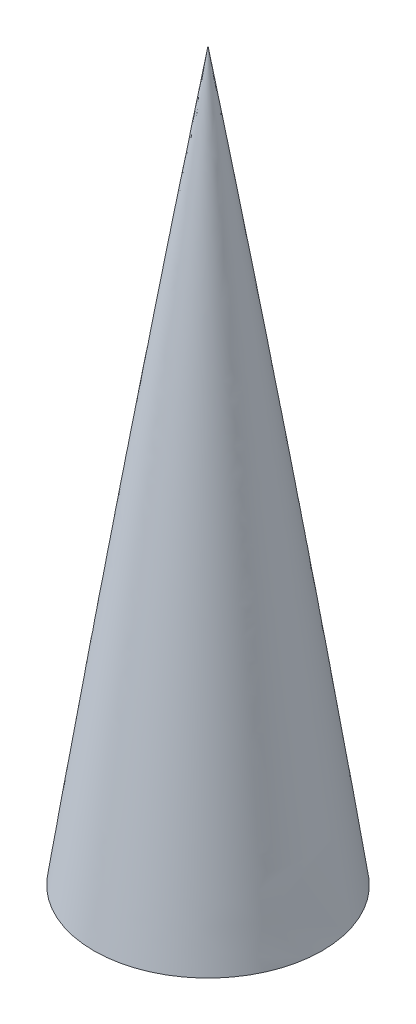
ISO-10303-21;
HEADER;
FILE_DESCRIPTION(('STEP AP214'),'2;1');
FILE_NAME('part.step','',(''),(''),'','','');
FILE_SCHEMA(('AUTOMOTIVE_DESIGN { 1 0 10303 214 1 1 1 1 }'));
ENDSEC;
DATA;
#1=APPLICATION_CONTEXT('core data for automotive mechanical design processes');
#2=APPLICATION_PROTOCOL_DEFINITION('international standard','automotive_design',2000,#1);
#3=PRODUCT_CONTEXT('',#1,'mechanical');
#4=PRODUCT('Part','Part','',(#3));
#5=PRODUCT_RELATED_PRODUCT_CATEGORY('part','',(#4));
#6=PRODUCT_DEFINITION_FORMATION('','',#4);
#7=PRODUCT_DEFINITION_CONTEXT('part definition',#1,'design');
#8=PRODUCT_DEFINITION('design','',#6,#7);
#9=PRODUCT_DEFINITION_SHAPE('','',#8);
#10=(LENGTH_UNIT() NAMED_UNIT(*) SI_UNIT(.MILLI.,.METRE.));
#11=(NAMED_UNIT(*) PLANE_ANGLE_UNIT() SI_UNIT($,.RADIAN.));
#12=(NAMED_UNIT(*) SI_UNIT($,.STERADIAN.) SOLID_ANGLE_UNIT());
#13=UNCERTAINTY_MEASURE_WITH_UNIT(LENGTH_MEASURE(1.E-05),#10,'distance_accuracy_value','');
#14=(GEOMETRIC_REPRESENTATION_CONTEXT(3) GLOBAL_UNCERTAINTY_ASSIGNED_CONTEXT((#13)) GLOBAL_UNIT_ASSIGNED_CONTEXT((#10,
#11,#12)) REPRESENTATION_CONTEXT('',''));
#15=CARTESIAN_POINT('',(0.,0.,0.));
#16=DIRECTION('',(0.,0.,1.));
#17=DIRECTION('',(1.,0.,0.));
#18=AXIS2_PLACEMENT_3D('',#15,#16,#17);
#19=CARTESIAN_POINT('',(-11.9697874824656,533.4,0.));
#20=DIRECTION('',(0.,1.,0.));
#21=DIRECTION('',(0.,0.,1.));
#22=AXIS2_PLACEMENT_3D('',#19,#20,#21);
#23=PLANE('',#22);
#24=CARTESIAN_POINT('',(0.,533.4,0.));
#25=DIRECTION('',(0.,-1.,0.));
#26=DIRECTION('',(0.,0.,-1.));
#27=AXIS2_PLACEMENT_3D('',#24,#25,#26);
#28=CIRCLE('',#27,11.9697874824656);
#29=CARTESIAN_POINT('',(0.,533.4,-11.9697874824656));
#30=VERTEX_POINT('',#29);
#31=EDGE_CURVE('E11',#30,#30,#28,.T.);
#32=ORIENTED_EDGE('',*,*,#31,.T.);
#33=EDGE_LOOP('',(#32));
#34=FACE_BOUND('',#33,.T.);
#35=ADVANCED_FACE('F33',(#34),#23,.F.);
#36=CARTESIAN_POINT('',(0.,-2.72004641033163E-12,3632.19999999999));
#37=DIRECTION('',(-1.,0.,0.));
#38=DIRECTION('',(0.,0.,-1.));
#39=AXIS2_PLACEMENT_3D('',#36,#37,#38);
#40=CIRCLE('',#39,3682.99999999999);
#41=TRIMMED_CURVE('',#40,(PARAMETER_VALUE(-0.166282463776883)),
(PARAMETER_VALUE(0.166282463776883)),.T.,.PARAMETER.);
#42=CARTESIAN_POINT('',(0.,-2.72004641033163E-12,0.));
#43=DIRECTION('',(0.,-1.,0.));
#44=AXIS1_PLACEMENT('',#42,#43);
#45=SURFACE_OF_REVOLUTION('',#41,#44);
#46=CARTESIAN_POINT('',(0.,609.599999999998,0.));
#47=VERTEX_POINT('',#46);
#48=VERTEX_LOOP('',#47);
#49=FACE_BOUND('',#48,.T.);
#50=ORIENTED_EDGE('',*,*,#31,.F.);
#51=EDGE_LOOP('',(#50));
#52=FACE_BOUND('',#51,.T.);
#53=ADVANCED_FACE('F40',(#49,#52),#45,.T.);
#54=CLOSED_SHELL('',(#35,#53));
#55=MANIFOLD_SOLID_BREP('B2',#54);
#56=ADVANCED_BREP_SHAPE_REPRESENTATION('',(#18,#55),#14);
#57=SHAPE_DEFINITION_REPRESENTATION(#9,#56);
ENDSEC;
END-ISO-10303-21;
